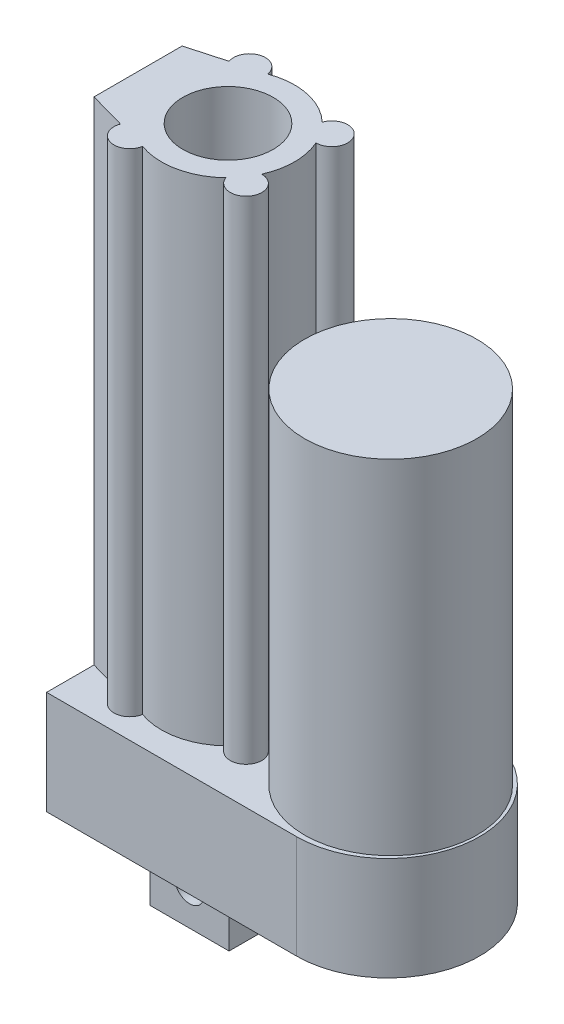
ISO-10303-21;
HEADER;
FILE_DESCRIPTION(('STEP AP214'),'2;1');
FILE_NAME('part.step','',(''),(''),'','','');
FILE_SCHEMA(('AUTOMOTIVE_DESIGN { 1 0 10303 214 1 1 1 1 }'));
ENDSEC;
DATA;
#1=APPLICATION_CONTEXT('core data for automotive mechanical design processes');
#2=APPLICATION_PROTOCOL_DEFINITION('international standard','automotive_design',2000,#1);
#3=PRODUCT_CONTEXT('',#1,'mechanical');
#4=PRODUCT('Part','Part','',(#3));
#5=PRODUCT_RELATED_PRODUCT_CATEGORY('part','',(#4));
#6=PRODUCT_DEFINITION_FORMATION('','',#4);
#7=PRODUCT_DEFINITION_CONTEXT('part definition',#1,'design');
#8=PRODUCT_DEFINITION('design','',#6,#7);
#9=PRODUCT_DEFINITION_SHAPE('','',#8);
#10=(LENGTH_UNIT() NAMED_UNIT(*) SI_UNIT(.MILLI.,.METRE.));
#11=(NAMED_UNIT(*) PLANE_ANGLE_UNIT() SI_UNIT($,.RADIAN.));
#12=(NAMED_UNIT(*) SI_UNIT($,.STERADIAN.) SOLID_ANGLE_UNIT());
#13=UNCERTAINTY_MEASURE_WITH_UNIT(LENGTH_MEASURE(1.E-05),#10,'distance_accuracy_value','');
#14=(GEOMETRIC_REPRESENTATION_CONTEXT(3) GLOBAL_UNCERTAINTY_ASSIGNED_CONTEXT((#13)) GLOBAL_UNIT_ASSIGNED_CONTEXT((#10,
#11,#12)) REPRESENTATION_CONTEXT('',''));
#15=CARTESIAN_POINT('',(0.,0.,0.));
#16=DIRECTION('',(0.,0.,1.));
#17=DIRECTION('',(1.,0.,0.));
#18=AXIS2_PLACEMENT_3D('',#15,#16,#17);
#19=CARTESIAN_POINT('',(35.440737563232,-22.9,0.));
#20=DIRECTION('',(0.,1.,0.));
#21=DIRECTION('',(0.,0.,1.));
#22=AXIS2_PLACEMENT_3D('',#19,#20,#21);
#23=PLANE('',#22);
#24=DIRECTION('',(-1.,0.,0.));
#25=VECTOR('',#24,1.);
#26=CARTESIAN_POINT('',(35.440737563232,-22.9,-20.25));
#27=LINE('',#26,#25);
#28=CARTESIAN_POINT('',(35.440737563232,-22.9,-20.25));
#29=VERTEX_POINT('',#28);
#30=CARTESIAN_POINT('',(-19.909262436768,-22.9,-20.25));
#31=VERTEX_POINT('',#30);
#32=EDGE_CURVE('E190',#29,#31,#27,.T.);
#33=ORIENTED_EDGE('',*,*,#32,.F.);
#34=CARTESIAN_POINT('',(35.440737563232,-22.9,0.));
#35=DIRECTION('',(0.,1.,0.));
#36=DIRECTION('',(0.,0.,1.));
#37=AXIS2_PLACEMENT_3D('',#34,#35,#36);
#38=CIRCLE('',#37,20.25);
#39=CARTESIAN_POINT('',(35.440737563232,-22.9,20.25));
#40=VERTEX_POINT('',#39);
#41=EDGE_CURVE('E200',#40,#29,#38,.T.);
#42=ORIENTED_EDGE('',*,*,#41,.F.);
#43=DIRECTION('',(1.,0.,0.));
#44=VECTOR('',#43,1.);
#45=CARTESIAN_POINT('',(-19.909262436768,-22.9,20.25));
#46=LINE('',#45,#44);
#47=CARTESIAN_POINT('',(-19.909262436768,-22.9,20.25));
#48=VERTEX_POINT('',#47);
#49=EDGE_CURVE('E197',#48,#40,#46,.T.);
#50=ORIENTED_EDGE('',*,*,#49,.F.);
#51=DIRECTION('',(0.,0.,1.));
#52=VECTOR('',#51,1.);
#53=CARTESIAN_POINT('',(-19.909262436768,-22.9,-20.25));
#54=LINE('',#53,#52);
#55=EDGE_CURVE('E193',#31,#48,#54,.T.);
#56=ORIENTED_EDGE('',*,*,#55,.F.);
#57=EDGE_LOOP('',(#33,#42,#50,#56));
#58=FACE_BOUND('',#57,.T.);
#59=DIRECTION('',(0.,0.,-1.));
#60=VECTOR('',#59,1.);
#61=CARTESIAN_POINT('',(-8.50926243676795,-22.9,8.75));
#62=LINE('',#61,#60);
#63=CARTESIAN_POINT('',(-8.50926243676795,-22.9,8.75));
#64=VERTEX_POINT('',#63);
#65=CARTESIAN_POINT('',(-8.50926243676795,-22.9,-8.75));
#66=VERTEX_POINT('',#65);
#67=EDGE_CURVE('E48',#64,#66,#62,.T.);
#68=ORIENTED_EDGE('',*,*,#67,.F.);
#69=DIRECTION('',(-1.,0.,0.));
#70=VECTOR('',#69,1.);
#71=CARTESIAN_POINT('',(-8.50926243676795,-22.9,8.75));
#72=LINE('',#71,#70);
#73=CARTESIAN_POINT('',(8.99073756323205,-22.9,8.75));
#74=VERTEX_POINT('',#73);
#75=EDGE_CURVE('E52',#74,#64,#72,.T.);
#76=ORIENTED_EDGE('',*,*,#75,.F.);
#77=DIRECTION('',(0.,0.,1.));
#78=VECTOR('',#77,1.);
#79=CARTESIAN_POINT('',(8.99073756323205,-22.9,8.75));
#80=LINE('',#79,#78);
#81=CARTESIAN_POINT('',(8.99073756323205,-22.9,-8.75));
#82=VERTEX_POINT('',#81);
#83=EDGE_CURVE('E578',#82,#74,#80,.T.);
#84=ORIENTED_EDGE('',*,*,#83,.F.);
#85=DIRECTION('',(1.,0.,0.));
#86=VECTOR('',#85,1.);
#87=CARTESIAN_POINT('',(-8.50926243676795,-22.9,-8.75));
#88=LINE('',#87,#86);
#89=EDGE_CURVE('E576',#66,#82,#88,.T.);
#90=ORIENTED_EDGE('',*,*,#89,.F.);
#91=EDGE_LOOP('',(#68,#76,#84,#90));
#92=FACE_BOUND('',#91,.T.);
#93=ADVANCED_FACE('F33',(#58,#92),#23,.F.);
#94=CARTESIAN_POINT('',(-3.97100443792464,108.9,14.205408257209));
#95=DIRECTION('',(0.269220639859298,0.,-0.963078525912477));
#96=DIRECTION('',(-0.963078525912477,0.,-0.269220639859298));
#97=AXIS2_PLACEMENT_3D('',#94,#95,#96);
#98=PLANE('',#97);
#99=DIRECTION('',(0.963078525912477,0.,0.269220639859298));
#100=VECTOR('',#99,1.);
#101=CARTESIAN_POINT('',(-3.97100443792464,0.,14.205408257209));
#102=LINE('',#101,#100);
#103=CARTESIAN_POINT('',(-19.909262436768,0.,9.75));
#104=VERTEX_POINT('',#103);
#105=CARTESIAN_POINT('',(-11.7703811989921,0.,12.0251569634437));
#106=VERTEX_POINT('',#105);
#107=EDGE_CURVE('E216',#104,#106,#102,.T.);
#108=ORIENTED_EDGE('',*,*,#107,.T.);
#109=DIRECTION('',(0.,-1.,0.));
#110=VECTOR('',#109,1.);
#111=CARTESIAN_POINT('',(-11.7703811989921,108.9,12.0251569634437));
#112=LINE('',#111,#110);
#113=CARTESIAN_POINT('',(-11.7703811989921,108.9,12.0251569634437));
#114=VERTEX_POINT('',#113);
#115=EDGE_CURVE('E11',#114,#106,#112,.T.);
#116=ORIENTED_EDGE('',*,*,#115,.F.);
#117=DIRECTION('',(0.963078525912477,0.,0.269220639859298));
#118=VECTOR('',#117,1.);
#119=CARTESIAN_POINT('',(-3.97100443792464,108.9,14.205408257209));
#120=LINE('',#119,#118);
#121=CARTESIAN_POINT('',(-19.909262436768,108.9,9.75));
#122=VERTEX_POINT('',#121);
#123=EDGE_CURVE('E223',#122,#114,#120,.T.);
#124=ORIENTED_EDGE('',*,*,#123,.F.);
#125=DIRECTION('',(0.,-1.,0.));
#126=VECTOR('',#125,1.);
#127=CARTESIAN_POINT('',(-19.909262436768,108.9,9.75));
#128=LINE('',#127,#126);
#129=EDGE_CURVE('E243',#122,#104,#128,.T.);
#130=ORIENTED_EDGE('',*,*,#129,.T.);
#131=EDGE_LOOP('',(#108,#116,#124,#130));
#132=FACE_BOUND('',#131,.T.);
#133=ADVANCED_FACE('F35',(#132),#98,.F.);
#134=CARTESIAN_POINT('',(-8.49169860749299,108.9,13.25));
#135=DIRECTION('',(0.,-1.,0.));
#136=DIRECTION('',(0.,0.,-1.));
#137=AXIS2_PLACEMENT_3D('',#134,#135,#136);
#138=CYLINDRICAL_SURFACE('',#137,3.5);
#139=CARTESIAN_POINT('',(-8.49169860749299,0.,13.25));
#140=DIRECTION('',(0.,1.,0.));
#141=DIRECTION('',(0.,0.,1.));
#142=AXIS2_PLACEMENT_3D('',#139,#140,#141);
#143=CIRCLE('',#142,3.5);
#144=CARTESIAN_POINT('',(-5.04531483382681,0.,13.860277711055));
#145=VERTEX_POINT('',#144);
#146=EDGE_CURVE('E246',#106,#145,#143,.T.);
#147=ORIENTED_EDGE('',*,*,#146,.T.);
#148=DIRECTION('',(0.,-1.,0.));
#149=VECTOR('',#148,1.);
#150=CARTESIAN_POINT('',(-5.04531483382681,108.9,13.860277711055));
#151=LINE('',#150,#149);
#152=CARTESIAN_POINT('',(-5.04531483382681,108.9,13.860277711055));
#153=VERTEX_POINT('',#152);
#154=EDGE_CURVE('E41',#153,#145,#151,.T.);
#155=ORIENTED_EDGE('',*,*,#154,.F.);
#156=CARTESIAN_POINT('',(-8.49169860749299,108.9,13.25));
#157=DIRECTION('',(0.,1.,0.));
#158=DIRECTION('',(0.,0.,1.));
#159=AXIS2_PLACEMENT_3D('',#156,#157,#158);
#160=CIRCLE('',#159,3.5);
#161=EDGE_CURVE('E226',#114,#153,#160,.T.);
#162=ORIENTED_EDGE('',*,*,#161,.F.);
#163=ORIENTED_EDGE('',*,*,#115,.T.);
#164=EDGE_LOOP('',(#147,#155,#162,#163));
#165=FACE_BOUND('',#164,.T.);
#166=ADVANCED_FACE('F294',(#165),#138,.T.);
#167=CARTESIAN_POINT('',(0.,108.9,0.));
#168=DIRECTION('',(0.,-1.,0.));
#169=DIRECTION('',(0.,0.,-1.));
#170=AXIS2_PLACEMENT_3D('',#167,#168,#169);
#171=CYLINDRICAL_SURFACE('',#170,14.75);
#172=CARTESIAN_POINT('',(0.,0.,0.));
#173=DIRECTION('',(0.,1.,0.));
#174=DIRECTION('',(0.,0.,1.));
#175=AXIS2_PLACEMENT_3D('',#172,#173,#174);
#176=CIRCLE('',#175,14.75);
#177=CARTESIAN_POINT('',(10.1900413867708,0.,10.6642185150108));
#178=VERTEX_POINT('',#177);
#179=EDGE_CURVE('E249',#145,#178,#176,.T.);
#180=ORIENTED_EDGE('',*,*,#179,.T.);
#181=DIRECTION('',(0.,-1.,0.));
#182=VECTOR('',#181,1.);
#183=CARTESIAN_POINT('',(10.1900413867708,108.9,10.6642185150108));
#184=LINE('',#183,#182);
#185=CARTESIAN_POINT('',(10.1900413867708,108.9,10.6642185150108));
#186=VERTEX_POINT('',#185);
#187=EDGE_CURVE('E285',#186,#178,#184,.T.);
#188=ORIENTED_EDGE('',*,*,#187,.F.);
#189=CARTESIAN_POINT('',(0.,108.9,0.));
#190=DIRECTION('',(0.,1.,0.));
#191=DIRECTION('',(0.,0.,1.));
#192=AXIS2_PLACEMENT_3D('',#189,#190,#191);
#193=CIRCLE('',#192,14.75);
#194=EDGE_CURVE('E229',#153,#186,#193,.T.);
#195=ORIENTED_EDGE('',*,*,#194,.F.);
#196=ORIENTED_EDGE('',*,*,#154,.T.);
#197=EDGE_LOOP('',(#180,#188,#195,#196));
#198=FACE_BOUND('',#197,.T.);
#199=ADVANCED_FACE('F291',(#198),#171,.T.);
#200=CARTESIAN_POINT('',(13.490737563232,108.9,9.5));
#201=DIRECTION('',(0.,-1.,0.));
#202=DIRECTION('',(0.,0.,-1.));
#203=AXIS2_PLACEMENT_3D('',#200,#201,#202);
#204=CYLINDRICAL_SURFACE('',#203,3.5);
#205=CARTESIAN_POINT('',(13.490737563232,0.,9.5));
#206=DIRECTION('',(0.,1.,0.));
#207=DIRECTION('',(0.,0.,1.));
#208=AXIS2_PLACEMENT_3D('',#205,#206,#207);
#209=CIRCLE('',#208,3.5);
#210=CARTESIAN_POINT('',(13.4744961983201,0.,6.00003768333632));
#211=VERTEX_POINT('',#210);
#212=EDGE_CURVE('E252',#178,#211,#209,.T.);
#213=ORIENTED_EDGE('',*,*,#212,.T.);
#214=DIRECTION('',(0.,-1.,0.));
#215=VECTOR('',#214,1.);
#216=CARTESIAN_POINT('',(13.4744961983201,108.9,6.00003768333632));
#217=LINE('',#216,#215);
#218=CARTESIAN_POINT('',(13.4744961983201,108.9,6.00003768333632));
#219=VERTEX_POINT('',#218);
#220=EDGE_CURVE('E282',#219,#211,#217,.T.);
#221=ORIENTED_EDGE('',*,*,#220,.F.);
#222=CARTESIAN_POINT('',(13.490737563232,108.9,9.5));
#223=DIRECTION('',(0.,1.,0.));
#224=DIRECTION('',(0.,0.,1.));
#225=AXIS2_PLACEMENT_3D('',#222,#223,#224);
#226=CIRCLE('',#225,3.5);
#227=EDGE_CURVE('E231',#186,#219,#226,.T.);
#228=ORIENTED_EDGE('',*,*,#227,.F.);
#229=ORIENTED_EDGE('',*,*,#187,.T.);
#230=EDGE_LOOP('',(#213,#221,#228,#229));
#231=FACE_BOUND('',#230,.T.);
#232=ADVANCED_FACE('F302',(#231),#204,.T.);
#233=CARTESIAN_POINT('',(13.4744961983201,0.,-6.00003768333632));
#234=VERTEX_POINT('',#233);
#235=EDGE_CURVE('E254',#211,#234,#176,.T.);
#236=ORIENTED_EDGE('',*,*,#235,.T.);
#237=DIRECTION('',(0.,-1.,0.));
#238=VECTOR('',#237,1.);
#239=CARTESIAN_POINT('',(13.4744961983201,108.9,-6.00003768333632));
#240=LINE('',#239,#238);
#241=CARTESIAN_POINT('',(13.4744961983201,108.9,-6.00003768333632));
#242=VERTEX_POINT('',#241);
#243=EDGE_CURVE('E279',#242,#234,#240,.T.);
#244=ORIENTED_EDGE('',*,*,#243,.F.);
#245=EDGE_CURVE('E233',#219,#242,#193,.T.);
#246=ORIENTED_EDGE('',*,*,#245,.F.);
#247=ORIENTED_EDGE('',*,*,#220,.T.);
#248=EDGE_LOOP('',(#236,#244,#246,#247));
#249=FACE_BOUND('',#248,.T.);
#250=ADVANCED_FACE('F306',(#249),#171,.T.);
#251=CARTESIAN_POINT('',(13.490737563232,108.9,-9.5));
#252=DIRECTION('',(0.,-1.,0.));
#253=DIRECTION('',(0.,0.,-1.));
#254=AXIS2_PLACEMENT_3D('',#251,#252,#253);
#255=CYLINDRICAL_SURFACE('',#254,3.5);
#256=CARTESIAN_POINT('',(13.490737563232,0.,-9.5));
#257=DIRECTION('',(0.,1.,0.));
#258=DIRECTION('',(0.,0.,1.));
#259=AXIS2_PLACEMENT_3D('',#256,#257,#258);
#260=CIRCLE('',#259,3.5);
#261=CARTESIAN_POINT('',(10.1900413867708,0.,-10.6642185150108));
#262=VERTEX_POINT('',#261);
#263=EDGE_CURVE('E257',#234,#262,#260,.T.);
#264=ORIENTED_EDGE('',*,*,#263,.T.);
#265=DIRECTION('',(0.,-1.,0.));
#266=VECTOR('',#265,1.);
#267=CARTESIAN_POINT('',(10.1900413867708,108.9,-10.6642185150108));
#268=LINE('',#267,#266);
#269=CARTESIAN_POINT('',(10.1900413867708,108.9,-10.6642185150108));
#270=VERTEX_POINT('',#269);
#271=EDGE_CURVE('E276',#270,#262,#268,.T.);
#272=ORIENTED_EDGE('',*,*,#271,.F.);
#273=CARTESIAN_POINT('',(13.490737563232,108.9,-9.5));
#274=DIRECTION('',(0.,1.,0.));
#275=DIRECTION('',(0.,0.,1.));
#276=AXIS2_PLACEMENT_3D('',#273,#274,#275);
#277=CIRCLE('',#276,3.5);
#278=EDGE_CURVE('E235',#242,#270,#277,.T.);
#279=ORIENTED_EDGE('',*,*,#278,.F.);
#280=ORIENTED_EDGE('',*,*,#243,.T.);
#281=EDGE_LOOP('',(#264,#272,#279,#280));
#282=FACE_BOUND('',#281,.T.);
#283=ADVANCED_FACE('F372',(#282),#255,.T.);
#284=CARTESIAN_POINT('',(-5.04531483382681,0.,-13.860277711055));
#285=VERTEX_POINT('',#284);
#286=EDGE_CURVE('E253',#262,#285,#176,.T.);
#287=ORIENTED_EDGE('',*,*,#286,.T.);
#288=DIRECTION('',(0.,-1.,0.));
#289=VECTOR('',#288,1.);
#290=CARTESIAN_POINT('',(-5.04531483382681,108.9,-13.860277711055));
#291=LINE('',#290,#289);
#292=CARTESIAN_POINT('',(-5.04531483382681,108.9,-13.860277711055));
#293=VERTEX_POINT('',#292);
#294=EDGE_CURVE('E273',#293,#285,#291,.T.);
#295=ORIENTED_EDGE('',*,*,#294,.F.);
#296=EDGE_CURVE('E232',#270,#293,#193,.T.);
#297=ORIENTED_EDGE('',*,*,#296,.F.);
#298=ORIENTED_EDGE('',*,*,#271,.T.);
#299=EDGE_LOOP('',(#287,#295,#297,#298));
#300=FACE_BOUND('',#299,.T.);
#301=ADVANCED_FACE('F318',(#300),#171,.T.);
#302=CARTESIAN_POINT('',(-8.49169860749299,108.9,-13.25));
#303=DIRECTION('',(0.,-1.,0.));
#304=DIRECTION('',(0.,0.,-1.));
#305=AXIS2_PLACEMENT_3D('',#302,#303,#304);
#306=CYLINDRICAL_SURFACE('',#305,3.5);
#307=CARTESIAN_POINT('',(-8.49169860749299,0.,-13.25));
#308=DIRECTION('',(0.,1.,0.));
#309=DIRECTION('',(0.,0.,1.));
#310=AXIS2_PLACEMENT_3D('',#307,#308,#309);
#311=CIRCLE('',#310,3.5);
#312=CARTESIAN_POINT('',(-11.7703811989921,0.,-12.0251569634437));
#313=VERTEX_POINT('',#312);
#314=EDGE_CURVE('E260',#285,#313,#311,.T.);
#315=ORIENTED_EDGE('',*,*,#314,.T.);
#316=DIRECTION('',(0.,-1.,0.));
#317=VECTOR('',#316,1.);
#318=CARTESIAN_POINT('',(-11.7703811989921,108.9,-12.0251569634437));
#319=LINE('',#318,#317);
#320=CARTESIAN_POINT('',(-11.7703811989921,108.9,-12.0251569634437));
#321=VERTEX_POINT('',#320);
#322=EDGE_CURVE('E270',#321,#313,#319,.T.);
#323=ORIENTED_EDGE('',*,*,#322,.F.);
#324=CARTESIAN_POINT('',(-8.49169860749299,108.9,-13.25));
#325=DIRECTION('',(0.,1.,0.));
#326=DIRECTION('',(0.,0.,1.));
#327=AXIS2_PLACEMENT_3D('',#324,#325,#326);
#328=CIRCLE('',#327,3.5);
#329=EDGE_CURVE('E237',#293,#321,#328,.T.);
#330=ORIENTED_EDGE('',*,*,#329,.F.);
#331=ORIENTED_EDGE('',*,*,#294,.T.);
#332=EDGE_LOOP('',(#315,#323,#330,#331));
#333=FACE_BOUND('',#332,.T.);
#334=ADVANCED_FACE('F320',(#333),#306,.T.);
#335=CARTESIAN_POINT('',(-3.97100443792464,108.9,-14.205408257209));
#336=DIRECTION('',(0.269220639859298,0.,0.963078525912477));
#337=DIRECTION('',(0.963078525912477,0.,-0.269220639859298));
#338=AXIS2_PLACEMENT_3D('',#335,#336,#337);
#339=PLANE('',#338);
#340=DIRECTION('',(-0.963078525912477,0.,0.269220639859298));
#341=VECTOR('',#340,1.);
#342=CARTESIAN_POINT('',(-3.97100443792464,0.,-14.205408257209));
#343=LINE('',#342,#341);
#344=CARTESIAN_POINT('',(-19.909262436768,0.,-9.75));
#345=VERTEX_POINT('',#344);
#346=EDGE_CURVE('E227',#313,#345,#343,.T.);
#347=ORIENTED_EDGE('',*,*,#346,.T.);
#348=DIRECTION('',(0.,-1.,0.));
#349=VECTOR('',#348,1.);
#350=CARTESIAN_POINT('',(-19.909262436768,108.9,-9.75));
#351=LINE('',#350,#349);
#352=CARTESIAN_POINT('',(-19.909262436768,108.9,-9.75));
#353=VERTEX_POINT('',#352);
#354=EDGE_CURVE('E267',#353,#345,#351,.T.);
#355=ORIENTED_EDGE('',*,*,#354,.F.);
#356=DIRECTION('',(-0.963078525912477,0.,0.269220639859298));
#357=VECTOR('',#356,1.);
#358=CARTESIAN_POINT('',(-3.97100443792464,108.9,-14.205408257209));
#359=LINE('',#358,#357);
#360=EDGE_CURVE('E239',#321,#353,#359,.T.);
#361=ORIENTED_EDGE('',*,*,#360,.F.);
#362=ORIENTED_EDGE('',*,*,#322,.T.);
#363=EDGE_LOOP('',(#347,#355,#361,#362));
#364=FACE_BOUND('',#363,.T.);
#365=ADVANCED_FACE('F324',(#364),#339,.F.);
#366=CARTESIAN_POINT('',(-19.909262436768,108.9,0.));
#367=DIRECTION('',(1.,0.,0.));
#368=DIRECTION('',(0.,0.,-1.));
#369=AXIS2_PLACEMENT_3D('',#366,#367,#368);
#370=PLANE('',#369);
#371=ORIENTED_EDGE('',*,*,#354,.T.);
#372=DIRECTION('',(0.,0.,1.));
#373=VECTOR('',#372,1.);
#374=CARTESIAN_POINT('',(-19.909262436768,0.,-20.25));
#375=LINE('',#374,#373);
#376=CARTESIAN_POINT('',(-19.909262436768,0.,-20.25));
#377=VERTEX_POINT('',#376);
#378=EDGE_CURVE('E207',#377,#345,#375,.T.);
#379=ORIENTED_EDGE('',*,*,#378,.F.);
#380=DIRECTION('',(0.,1.,0.));
#381=VECTOR('',#380,1.);
#382=CARTESIAN_POINT('',(-19.909262436768,-22.9,-20.25));
#383=LINE('',#382,#381);
#384=EDGE_CURVE('E203',#31,#377,#383,.T.);
#385=ORIENTED_EDGE('',*,*,#384,.F.);
#386=ORIENTED_EDGE('',*,*,#55,.T.);
#387=DIRECTION('',(0.,1.,0.));
#388=VECTOR('',#387,1.);
#389=CARTESIAN_POINT('',(-19.909262436768,-22.9,20.25));
#390=LINE('',#389,#388);
#391=CARTESIAN_POINT('',(-19.909262436768,0.,20.25));
#392=VERTEX_POINT('',#391);
#393=EDGE_CURVE('E219',#48,#392,#390,.T.);
#394=ORIENTED_EDGE('',*,*,#393,.T.);
#395=EDGE_CURVE('E206',#104,#392,#375,.T.);
#396=ORIENTED_EDGE('',*,*,#395,.F.);
#397=ORIENTED_EDGE('',*,*,#129,.F.);
#398=DIRECTION('',(0.,0.,1.));
#399=VECTOR('',#398,1.);
#400=CARTESIAN_POINT('',(-19.909262436768,108.9,0.));
#401=LINE('',#400,#399);
#402=EDGE_CURVE('E241',#353,#122,#401,.T.);
#403=ORIENTED_EDGE('',*,*,#402,.F.);
#404=EDGE_LOOP('',(#371,#379,#385,#386,#394,#396,#397,#403));
#405=FACE_BOUND('',#404,.T.);
#406=ADVANCED_FACE('F329',(#405),#370,.F.);
#407=CARTESIAN_POINT('',(0.,108.9,0.));
#408=DIRECTION('',(0.,1.,0.));
#409=DIRECTION('',(0.,0.,1.));
#410=AXIS2_PLACEMENT_3D('',#407,#408,#409);
#411=PLANE('',#410);
#412=CARTESIAN_POINT('',(0.,108.9,0.));
#413=DIRECTION('',(0.,1.,0.));
#414=DIRECTION('',(0.,0.,1.));
#415=AXIS2_PLACEMENT_3D('',#412,#413,#414);
#416=CIRCLE('',#415,10.);
#417=CARTESIAN_POINT('',(0.,108.9,10.));
#418=VERTEX_POINT('',#417);
#419=EDGE_CURVE('E562',#418,#418,#416,.T.);
#420=ORIENTED_EDGE('',*,*,#419,.F.);
#421=EDGE_LOOP('',(#420));
#422=FACE_BOUND('',#421,.T.);
#423=ORIENTED_EDGE('',*,*,#123,.T.);
#424=ORIENTED_EDGE('',*,*,#161,.T.);
#425=ORIENTED_EDGE('',*,*,#194,.T.);
#426=ORIENTED_EDGE('',*,*,#227,.T.);
#427=ORIENTED_EDGE('',*,*,#245,.T.);
#428=ORIENTED_EDGE('',*,*,#278,.T.);
#429=ORIENTED_EDGE('',*,*,#296,.T.);
#430=ORIENTED_EDGE('',*,*,#329,.T.);
#431=ORIENTED_EDGE('',*,*,#360,.T.);
#432=ORIENTED_EDGE('',*,*,#402,.T.);
#433=EDGE_LOOP('',(#423,#424,#425,#426,#427,#428,#429,#430,#431,#432));
#434=FACE_BOUND('',#433,.T.);
#435=ADVANCED_FACE('F312',(#422,#434),#411,.T.);
#436=CARTESIAN_POINT('',(35.440737563232,-22.9,-20.25));
#437=DIRECTION('',(0.,0.,-1.));
#438=DIRECTION('',(-1.,0.,0.));
#439=AXIS2_PLACEMENT_3D('',#436,#437,#438);
#440=PLANE('',#439);
#441=DIRECTION('',(-1.,0.,0.));
#442=VECTOR('',#441,1.);
#443=CARTESIAN_POINT('',(35.440737563232,0.,-20.25));
#444=LINE('',#443,#442);
#445=CARTESIAN_POINT('',(35.440737563232,0.,-20.25));
#446=VERTEX_POINT('',#445);
#447=EDGE_CURVE('E188',#446,#377,#444,.T.);
#448=ORIENTED_EDGE('',*,*,#447,.F.);
#449=DIRECTION('',(0.,1.,0.));
#450=VECTOR('',#449,1.);
#451=CARTESIAN_POINT('',(35.440737563232,-22.9,-20.25));
#452=LINE('',#451,#450);
#453=EDGE_CURVE('E214',#29,#446,#452,.T.);
#454=ORIENTED_EDGE('',*,*,#453,.F.);
#455=ORIENTED_EDGE('',*,*,#32,.T.);
#456=ORIENTED_EDGE('',*,*,#384,.T.);
#457=EDGE_LOOP('',(#448,#454,#455,#456));
#458=FACE_BOUND('',#457,.T.);
#459=ADVANCED_FACE('F354',(#458),#440,.T.);
#460=CARTESIAN_POINT('',(35.440737563232,-22.9,0.));
#461=DIRECTION('',(0.,1.,0.));
#462=DIRECTION('',(0.,0.,1.));
#463=AXIS2_PLACEMENT_3D('',#460,#461,#462);
#464=CYLINDRICAL_SURFACE('',#463,20.25);
#465=CARTESIAN_POINT('',(35.440737563232,0.,0.));
#466=DIRECTION('',(0.,1.,0.));
#467=DIRECTION('',(0.,0.,1.));
#468=AXIS2_PLACEMENT_3D('',#465,#466,#467);
#469=CIRCLE('',#468,20.25);
#470=CARTESIAN_POINT('',(35.440737563232,0.,20.25));
#471=VERTEX_POINT('',#470);
#472=EDGE_CURVE('E194',#471,#446,#469,.T.);
#473=ORIENTED_EDGE('',*,*,#472,.F.);
#474=DIRECTION('',(0.,1.,0.));
#475=VECTOR('',#474,1.);
#476=CARTESIAN_POINT('',(35.440737563232,-22.9,20.25));
#477=LINE('',#476,#475);
#478=EDGE_CURVE('E217',#40,#471,#477,.T.);
#479=ORIENTED_EDGE('',*,*,#478,.F.);
#480=ORIENTED_EDGE('',*,*,#41,.T.);
#481=ORIENTED_EDGE('',*,*,#453,.T.);
#482=EDGE_LOOP('',(#473,#479,#480,#481));
#483=FACE_BOUND('',#482,.T.);
#484=ADVANCED_FACE('F351',(#483),#464,.T.);
#485=CARTESIAN_POINT('',(-19.909262436768,-22.9,20.25));
#486=DIRECTION('',(0.,0.,1.));
#487=DIRECTION('',(1.,0.,0.));
#488=AXIS2_PLACEMENT_3D('',#485,#486,#487);
#489=PLANE('',#488);
#490=DIRECTION('',(1.,0.,0.));
#491=VECTOR('',#490,1.);
#492=CARTESIAN_POINT('',(-19.909262436768,0.,20.25));
#493=LINE('',#492,#491);
#494=EDGE_CURVE('E209',#392,#471,#493,.T.);
#495=ORIENTED_EDGE('',*,*,#494,.F.);
#496=ORIENTED_EDGE('',*,*,#393,.F.);
#497=ORIENTED_EDGE('',*,*,#49,.T.);
#498=ORIENTED_EDGE('',*,*,#478,.T.);
#499=EDGE_LOOP('',(#495,#496,#497,#498));
#500=FACE_BOUND('',#499,.T.);
#501=ADVANCED_FACE('F349',(#500),#489,.T.);
#502=CARTESIAN_POINT('',(35.440737563232,0.,0.));
#503=DIRECTION('',(0.,1.,0.));
#504=DIRECTION('',(0.,0.,1.));
#505=AXIS2_PLACEMENT_3D('',#502,#503,#504);
#506=PLANE('',#505);
#507=CARTESIAN_POINT('',(36.0157375632321,0.,0.));
#508=DIRECTION('',(0.,1.,0.));
#509=DIRECTION('',(0.,0.,1.));
#510=AXIS2_PLACEMENT_3D('',#507,#508,#509);
#511=CIRCLE('',#510,19.075);
#512=CARTESIAN_POINT('',(36.0157375632321,0.,19.075));
#513=VERTEX_POINT('',#512);
#514=EDGE_CURVE('E178',#513,#513,#511,.T.);
#515=ORIENTED_EDGE('',*,*,#514,.F.);
#516=EDGE_LOOP('',(#515));
#517=FACE_BOUND('',#516,.T.);
#518=ORIENTED_EDGE('',*,*,#107,.F.);
#519=ORIENTED_EDGE('',*,*,#395,.T.);
#520=ORIENTED_EDGE('',*,*,#494,.T.);
#521=ORIENTED_EDGE('',*,*,#472,.T.);
#522=ORIENTED_EDGE('',*,*,#447,.T.);
#523=ORIENTED_EDGE('',*,*,#378,.T.);
#524=ORIENTED_EDGE('',*,*,#346,.F.);
#525=ORIENTED_EDGE('',*,*,#314,.F.);
#526=ORIENTED_EDGE('',*,*,#286,.F.);
#527=ORIENTED_EDGE('',*,*,#263,.F.);
#528=ORIENTED_EDGE('',*,*,#235,.F.);
#529=ORIENTED_EDGE('',*,*,#212,.F.);
#530=ORIENTED_EDGE('',*,*,#179,.F.);
#531=ORIENTED_EDGE('',*,*,#146,.F.);
#532=EDGE_LOOP('',(#518,#519,#520,#521,#522,#523,#524,#525,#526,#527,#528,#529,#530,#531));
#533=FACE_BOUND('',#532,.T.);
#534=ADVANCED_FACE('F297',(#517,#533),#506,.T.);
#535=CARTESIAN_POINT('',(36.0157375632321,76.,0.));
#536=DIRECTION('',(0.,-1.,0.));
#537=DIRECTION('',(0.,0.,-1.));
#538=AXIS2_PLACEMENT_3D('',#535,#536,#537);
#539=CYLINDRICAL_SURFACE('',#538,19.075);
#540=CARTESIAN_POINT('',(36.0157375632321,76.,0.));
#541=DIRECTION('',(0.,1.,0.));
#542=DIRECTION('',(0.,0.,1.));
#543=AXIS2_PLACEMENT_3D('',#540,#541,#542);
#544=CIRCLE('',#543,19.075);
#545=CARTESIAN_POINT('',(36.0157375632321,76.,19.075));
#546=VERTEX_POINT('',#545);
#547=EDGE_CURVE('E181',#546,#546,#544,.T.);
#548=ORIENTED_EDGE('',*,*,#547,.F.);
#549=EDGE_LOOP('',(#548));
#550=FACE_BOUND('',#549,.T.);
#551=ORIENTED_EDGE('',*,*,#514,.T.);
#552=EDGE_LOOP('',(#551));
#553=FACE_BOUND('',#552,.T.);
#554=ADVANCED_FACE('F345',(#550,#553),#539,.T.);
#555=CARTESIAN_POINT('',(36.0157375632321,76.,0.));
#556=DIRECTION('',(0.,1.,0.));
#557=DIRECTION('',(0.,0.,1.));
#558=AXIS2_PLACEMENT_3D('',#555,#556,#557);
#559=PLANE('',#558);
#560=ORIENTED_EDGE('',*,*,#547,.T.);
#561=EDGE_LOOP('',(#560));
#562=FACE_BOUND('',#561,.T.);
#563=ADVANCED_FACE('F466',(#562),#559,.T.);
#564=CARTESIAN_POINT('',(-8.50926243676795,-40.9,8.75));
#565=DIRECTION('',(1.,0.,0.));
#566=DIRECTION('',(0.,0.,-1.));
#567=AXIS2_PLACEMENT_3D('',#564,#565,#566);
#568=PLANE('',#567);
#569=ORIENTED_EDGE('',*,*,#67,.T.);
#570=DIRECTION('',(0.,1.,0.));
#571=VECTOR('',#570,1.);
#572=CARTESIAN_POINT('',(-8.50926243676795,-40.9,-8.75));
#573=LINE('',#572,#571);
#574=CARTESIAN_POINT('',(-8.50926243676795,-40.9,-8.75));
#575=VERTEX_POINT('',#574);
#576=EDGE_CURVE('E161',#575,#66,#573,.T.);
#577=ORIENTED_EDGE('',*,*,#576,.F.);
#578=DIRECTION('',(0.,0.,-1.));
#579=VECTOR('',#578,1.);
#580=CARTESIAN_POINT('',(-8.50926243676795,-40.9,8.75));
#581=LINE('',#580,#579);
#582=CARTESIAN_POINT('',(-8.50926243676795,-40.9,8.75));
#583=VERTEX_POINT('',#582);
#584=EDGE_CURVE('E167',#583,#575,#581,.T.);
#585=ORIENTED_EDGE('',*,*,#584,.F.);
#586=DIRECTION('',(0.,1.,0.));
#587=VECTOR('',#586,1.);
#588=CARTESIAN_POINT('',(-8.50926243676795,-40.9,8.75));
#589=LINE('',#588,#587);
#590=EDGE_CURVE('E574',#583,#64,#589,.T.);
#591=ORIENTED_EDGE('',*,*,#590,.T.);
#592=EDGE_LOOP('',(#569,#577,#585,#591));
#593=FACE_BOUND('',#592,.T.);
#594=ADVANCED_FACE('F177',(#593),#568,.F.);
#595=CARTESIAN_POINT('',(-8.50926243676795,-40.9,-8.75));
#596=DIRECTION('',(0.,0.,1.));
#597=DIRECTION('',(1.,0.,0.));
#598=AXIS2_PLACEMENT_3D('',#595,#596,#597);
#599=PLANE('',#598);
#600=CARTESIAN_POINT('',(0.240737563232052,-32.95,-8.75));
#601=DIRECTION('',(0.,0.,-1.));
#602=DIRECTION('',(-1.,0.,0.));
#603=AXIS2_PLACEMENT_3D('',#600,#601,#602);
#604=CIRCLE('',#603,3.25);
#605=CARTESIAN_POINT('',(-3.00926243676795,-32.95,-8.75));
#606=VERTEX_POINT('',#605);
#607=EDGE_CURVE('E561',#606,#606,#604,.T.);
#608=ORIENTED_EDGE('',*,*,#607,.F.);
#609=EDGE_LOOP('',(#608));
#610=FACE_BOUND('',#609,.T.);
#611=ORIENTED_EDGE('',*,*,#89,.T.);
#612=DIRECTION('',(0.,1.,0.));
#613=VECTOR('',#612,1.);
#614=CARTESIAN_POINT('',(8.99073756323205,-40.9,-8.75));
#615=LINE('',#614,#613);
#616=CARTESIAN_POINT('',(8.99073756323205,-40.9,-8.75));
#617=VERTEX_POINT('',#616);
#618=EDGE_CURVE('E163',#617,#82,#615,.T.);
#619=ORIENTED_EDGE('',*,*,#618,.F.);
#620=DIRECTION('',(1.,0.,0.));
#621=VECTOR('',#620,1.);
#622=CARTESIAN_POINT('',(-8.50926243676795,-40.9,-8.75));
#623=LINE('',#622,#621);
#624=EDGE_CURVE('E156',#575,#617,#623,.T.);
#625=ORIENTED_EDGE('',*,*,#624,.F.);
#626=ORIENTED_EDGE('',*,*,#576,.T.);
#627=EDGE_LOOP('',(#611,#619,#625,#626));
#628=FACE_BOUND('',#627,.T.);
#629=ADVANCED_FACE('F159',(#610,#628),#599,.F.);
#630=CARTESIAN_POINT('',(8.99073756323205,-40.9,8.75));
#631=DIRECTION('',(-1.,0.,0.));
#632=DIRECTION('',(0.,0.,1.));
#633=AXIS2_PLACEMENT_3D('',#630,#631,#632);
#634=PLANE('',#633);
#635=ORIENTED_EDGE('',*,*,#83,.T.);
#636=DIRECTION('',(0.,1.,0.));
#637=VECTOR('',#636,1.);
#638=CARTESIAN_POINT('',(8.99073756323205,-40.9,8.75));
#639=LINE('',#638,#637);
#640=CARTESIAN_POINT('',(8.99073756323205,-40.9,8.75));
#641=VERTEX_POINT('',#640);
#642=EDGE_CURVE('E183',#641,#74,#639,.T.);
#643=ORIENTED_EDGE('',*,*,#642,.F.);
#644=DIRECTION('',(0.,0.,1.));
#645=VECTOR('',#644,1.);
#646=CARTESIAN_POINT('',(8.99073756323205,-40.9,8.75));
#647=LINE('',#646,#645);
#648=EDGE_CURVE('E166',#617,#641,#647,.T.);
#649=ORIENTED_EDGE('',*,*,#648,.F.);
#650=ORIENTED_EDGE('',*,*,#618,.T.);
#651=EDGE_LOOP('',(#635,#643,#649,#650));
#652=FACE_BOUND('',#651,.T.);
#653=ADVANCED_FACE('F493',(#652),#634,.F.);
#654=CARTESIAN_POINT('',(-8.50926243676795,-40.9,8.75));
#655=DIRECTION('',(0.,0.,-1.));
#656=DIRECTION('',(-1.,0.,0.));
#657=AXIS2_PLACEMENT_3D('',#654,#655,#656);
#658=PLANE('',#657);
#659=CARTESIAN_POINT('',(0.240737563232053,-32.95,8.75));
#660=DIRECTION('',(0.,0.,-1.));
#661=DIRECTION('',(-1.,0.,0.));
#662=AXIS2_PLACEMENT_3D('',#659,#660,#661);
#663=CIRCLE('',#662,3.25);
#664=CARTESIAN_POINT('',(-3.00926243676795,-32.95,8.75));
#665=VERTEX_POINT('',#664);
#666=EDGE_CURVE('E565',#665,#665,#663,.F.);
#667=ORIENTED_EDGE('',*,*,#666,.F.);
#668=EDGE_LOOP('',(#667));
#669=FACE_BOUND('',#668,.T.);
#670=ORIENTED_EDGE('',*,*,#75,.T.);
#671=ORIENTED_EDGE('',*,*,#590,.F.);
#672=DIRECTION('',(-1.,0.,0.));
#673=VECTOR('',#672,1.);
#674=CARTESIAN_POINT('',(-8.50926243676795,-40.9,8.75));
#675=LINE('',#674,#673);
#676=EDGE_CURVE('E172',#641,#583,#675,.T.);
#677=ORIENTED_EDGE('',*,*,#676,.F.);
#678=ORIENTED_EDGE('',*,*,#642,.T.);
#679=EDGE_LOOP('',(#670,#671,#677,#678));
#680=FACE_BOUND('',#679,.T.);
#681=ADVANCED_FACE('F498',(#669,#680),#658,.F.);
#682=CARTESIAN_POINT('',(0.,-40.9,0.));
#683=DIRECTION('',(0.,-1.,0.));
#684=DIRECTION('',(0.,0.,-1.));
#685=AXIS2_PLACEMENT_3D('',#682,#683,#684);
#686=PLANE('',#685);
#687=ORIENTED_EDGE('',*,*,#584,.T.);
#688=ORIENTED_EDGE('',*,*,#624,.T.);
#689=ORIENTED_EDGE('',*,*,#648,.T.);
#690=ORIENTED_EDGE('',*,*,#676,.T.);
#691=EDGE_LOOP('',(#687,#688,#689,#690));
#692=FACE_BOUND('',#691,.T.);
#693=ADVANCED_FACE('F170',(#692),#686,.T.);
#694=CARTESIAN_POINT('',(0.240737563232054,-32.95,17.9423881554251));
#695=DIRECTION('',(0.,0.,-1.));
#696=DIRECTION('',(-1.,0.,0.));
#697=AXIS2_PLACEMENT_3D('',#694,#695,#696);
#698=CYLINDRICAL_SURFACE('',#697,3.25);
#699=CARTESIAN_POINT('',(-3.00926243676795,-32.95,8.75));
#700=CARTESIAN_POINT('',(-3.00926243676795,-32.95,8.56770833333334));
#701=CARTESIAN_POINT('',(-3.00926243676795,-32.95,8.38541666666667));
#702=CARTESIAN_POINT('',(-3.00926243676795,-32.95,8.02083333333333));
#703=CARTESIAN_POINT('',(-3.00926243676795,-32.95,7.83854166666667));
#704=CARTESIAN_POINT('',(-3.00926243676795,-32.95,7.47395833333333));
#705=CARTESIAN_POINT('',(-3.00926243676795,-32.95,7.29166666666667));
#706=CARTESIAN_POINT('',(-3.00926243676795,-32.95,6.92708333333334));
#707=CARTESIAN_POINT('',(-3.00926243676795,-32.95,6.74479166666667));
#708=CARTESIAN_POINT('',(-3.00926243676795,-32.95,6.38020833333334));
#709=CARTESIAN_POINT('',(-3.00926243676795,-32.95,6.19791666666667));
#710=CARTESIAN_POINT('',(-3.00926243676795,-32.95,5.83333333333334));
#711=CARTESIAN_POINT('',(-3.00926243676795,-32.95,5.65104166666667));
#712=CARTESIAN_POINT('',(-3.00926243676795,-32.95,5.28645833333334));
#713=CARTESIAN_POINT('',(-3.00926243676795,-32.95,5.10416666666667));
#714=CARTESIAN_POINT('',(-3.00926243676795,-32.95,4.73958333333334));
#715=CARTESIAN_POINT('',(-3.00926243676795,-32.95,4.55729166666667));
#716=CARTESIAN_POINT('',(-3.00926243676795,-32.95,4.19270833333334));
#717=CARTESIAN_POINT('',(-3.00926243676795,-32.95,4.01041666666667));
#718=CARTESIAN_POINT('',(-3.00926243676795,-32.95,3.64583333333333));
#719=CARTESIAN_POINT('',(-3.00926243676795,-32.95,3.46354166666667));
#720=CARTESIAN_POINT('',(-3.00926243676795,-32.95,3.09895833333334));
#721=CARTESIAN_POINT('',(-3.00926243676795,-32.95,2.91666666666667));
#722=CARTESIAN_POINT('',(-3.00926243676795,-32.95,2.55208333333334));
#723=CARTESIAN_POINT('',(-3.00926243676795,-32.95,2.36979166666667));
#724=CARTESIAN_POINT('',(-3.00926243676795,-32.95,2.00520833333334));
#725=CARTESIAN_POINT('',(-3.00926243676795,-32.95,1.82291666666667));
#726=CARTESIAN_POINT('',(-3.00926243676795,-32.95,1.45833333333334));
#727=CARTESIAN_POINT('',(-3.00926243676795,-32.95,1.27604166666667));
#728=CARTESIAN_POINT('',(-3.00926243676795,-32.95,0.911458333333338));
#729=CARTESIAN_POINT('',(-3.00926243676795,-32.95,0.729166666666672));
#730=CARTESIAN_POINT('',(-3.00926243676795,-32.95,0.364583333333338));
#731=CARTESIAN_POINT('',(-3.00926243676795,-32.95,0.182291666666671));
#732=CARTESIAN_POINT('',(-3.00926243676795,-32.95,-0.182291666666664));
#733=CARTESIAN_POINT('',(-3.00926243676795,-32.95,-0.364583333333331));
#734=CARTESIAN_POINT('',(-3.00926243676795,-32.95,-0.729166666666665));
#735=CARTESIAN_POINT('',(-3.00926243676795,-32.95,-0.911458333333331));
#736=CARTESIAN_POINT('',(-3.00926243676795,-32.95,-1.27604166666666));
#737=CARTESIAN_POINT('',(-3.00926243676795,-32.95,-1.45833333333333));
#738=CARTESIAN_POINT('',(-3.00926243676795,-32.95,-1.82291666666666));
#739=CARTESIAN_POINT('',(-3.00926243676795,-32.95,-2.00520833333333));
#740=CARTESIAN_POINT('',(-3.00926243676795,-32.95,-2.36979166666666));
#741=CARTESIAN_POINT('',(-3.00926243676795,-32.95,-2.55208333333333));
#742=CARTESIAN_POINT('',(-3.00926243676795,-32.95,-2.91666666666666));
#743=CARTESIAN_POINT('',(-3.00926243676795,-32.95,-3.09895833333333));
#744=CARTESIAN_POINT('',(-3.00926243676795,-32.95,-3.46354166666666));
#745=CARTESIAN_POINT('',(-3.00926243676795,-32.95,-3.64583333333333));
#746=CARTESIAN_POINT('',(-3.00926243676795,-32.95,-4.01041666666666));
#747=CARTESIAN_POINT('',(-3.00926243676795,-32.95,-4.19270833333333));
#748=CARTESIAN_POINT('',(-3.00926243676795,-32.95,-4.55729166666666));
#749=CARTESIAN_POINT('',(-3.00926243676795,-32.95,-4.73958333333333));
#750=CARTESIAN_POINT('',(-3.00926243676795,-32.95,-5.10416666666666));
#751=CARTESIAN_POINT('',(-3.00926243676795,-32.95,-5.28645833333333));
#752=CARTESIAN_POINT('',(-3.00926243676795,-32.95,-5.65104166666666));
#753=CARTESIAN_POINT('',(-3.00926243676795,-32.95,-5.83333333333333));
#754=CARTESIAN_POINT('',(-3.00926243676795,-32.95,-6.19791666666666));
#755=CARTESIAN_POINT('',(-3.00926243676795,-32.95,-6.38020833333333));
#756=CARTESIAN_POINT('',(-3.00926243676795,-32.95,-6.74479166666666));
#757=CARTESIAN_POINT('',(-3.00926243676795,-32.95,-6.92708333333333));
#758=CARTESIAN_POINT('',(-3.00926243676795,-32.95,-7.29166666666666));
#759=CARTESIAN_POINT('',(-3.00926243676795,-32.95,-7.47395833333333));
#760=CARTESIAN_POINT('',(-3.00926243676795,-32.95,-7.83854166666666));
#761=CARTESIAN_POINT('',(-3.00926243676795,-32.95,-8.02083333333333));
#762=CARTESIAN_POINT('',(-3.00926243676795,-32.95,-8.38541666666666));
#763=CARTESIAN_POINT('',(-3.00926243676795,-32.95,-8.56770833333333));
#764=CARTESIAN_POINT('',(-3.00926243676795,-32.95,-8.75));
#765=B_SPLINE_CURVE_WITH_KNOTS('',3,(#699,#700,#701,#702,#703,#704,#705,#706,#707,#708,#709,
#710,#711,#712,#713,#714,#715,#716,#717,#718,#719,#720,#721,#722,#723,#724,#725,#726,#727,#728,
#729,#730,#731,#732,#733,#734,#735,#736,#737,#738,#739,#740,#741,#742,#743,#744,#745,#746,#747,
#748,#749,#750,#751,#752,#753,#754,#755,#756,#757,#758,#759,#760,#761,#762,#763,#764),
.UNSPECIFIED.,.F.,.F.,(4,2,2,2,2,2,2,2,2,2,2,2,2,2,2,2,2,2,2,2,2,2,2,2,2,2,2,2,2,2,2,2,4),(0.,
0.546875,1.09375,1.640625,2.1875,2.734375,3.28125,3.828125,4.375,4.921875,5.46875,6.015625,
6.5625,7.109375,7.65625,8.203125,8.75,9.296875,9.84375,10.390625,10.9375,11.484375,12.03125,
12.578125,13.125,13.671875,14.21875,14.765625,15.3125,15.859375,16.40625,16.953125,17.5),.UNSPECIFIED.);
#766=EDGE_CURVE('BSEAM510',#665,#606,#765,.T.);
#767=ORIENTED_EDGE('',*,*,#666,.T.);
#768=ORIENTED_EDGE('',*,*,#607,.T.);
#769=ORIENTED_EDGE('',*,*,#766,.T.);
#770=ORIENTED_EDGE('',*,*,#766,.F.);
#771=EDGE_LOOP('',(#767,#769,#768,#770));
#772=FACE_BOUND('',#771,.T.);
#773=ADVANCED_FACE('F510',(#772),#698,.F.);
#774=CARTESIAN_POINT('',(0.,29.9,0.));
#775=DIRECTION('',(0.,1.,0.));
#776=DIRECTION('',(0.,0.,1.));
#777=AXIS2_PLACEMENT_3D('',#774,#775,#776);
#778=CYLINDRICAL_SURFACE('',#777,10.);
#779=CARTESIAN_POINT('',(0.,29.9,0.));
#780=DIRECTION('',(0.,1.,0.));
#781=DIRECTION('',(0.,0.,1.));
#782=AXIS2_PLACEMENT_3D('',#779,#780,#781);
#783=CIRCLE('',#782,10.);
#784=CARTESIAN_POINT('',(0.,29.9,10.));
#785=VERTEX_POINT('',#784);
#786=EDGE_CURVE('E560',#785,#785,#783,.T.);
#787=ORIENTED_EDGE('',*,*,#786,.F.);
#788=EDGE_LOOP('',(#787));
#789=FACE_BOUND('',#788,.T.);
#790=ORIENTED_EDGE('',*,*,#419,.T.);
#791=EDGE_LOOP('',(#790));
#792=FACE_BOUND('',#791,.T.);
#793=ADVANCED_FACE('F532',(#789,#792),#778,.F.);
#794=CARTESIAN_POINT('',(0.,29.9,0.));
#795=DIRECTION('',(0.,1.,0.));
#796=DIRECTION('',(0.,0.,1.));
#797=AXIS2_PLACEMENT_3D('',#794,#795,#796);
#798=PLANE('',#797);
#799=ORIENTED_EDGE('',*,*,#786,.T.);
#800=EDGE_LOOP('',(#799));
#801=FACE_BOUND('',#800,.T.);
#802=ADVANCED_FACE('F544',(#801),#798,.T.);
#803=CLOSED_SHELL('',(#93,#133,#166,#199,#232,#250,#283,#301,#334,#365,#406,#435,#459,#484,#501,
#534,#554,#563,#594,#629,#653,#681,#693,#773,#793,#802));
#804=MANIFOLD_SOLID_BREP('B2',#803);
#805=ADVANCED_BREP_SHAPE_REPRESENTATION('',(#18,#804),#14);
#806=SHAPE_DEFINITION_REPRESENTATION(#9,#805);
ENDSEC;
END-ISO-10303-21;
